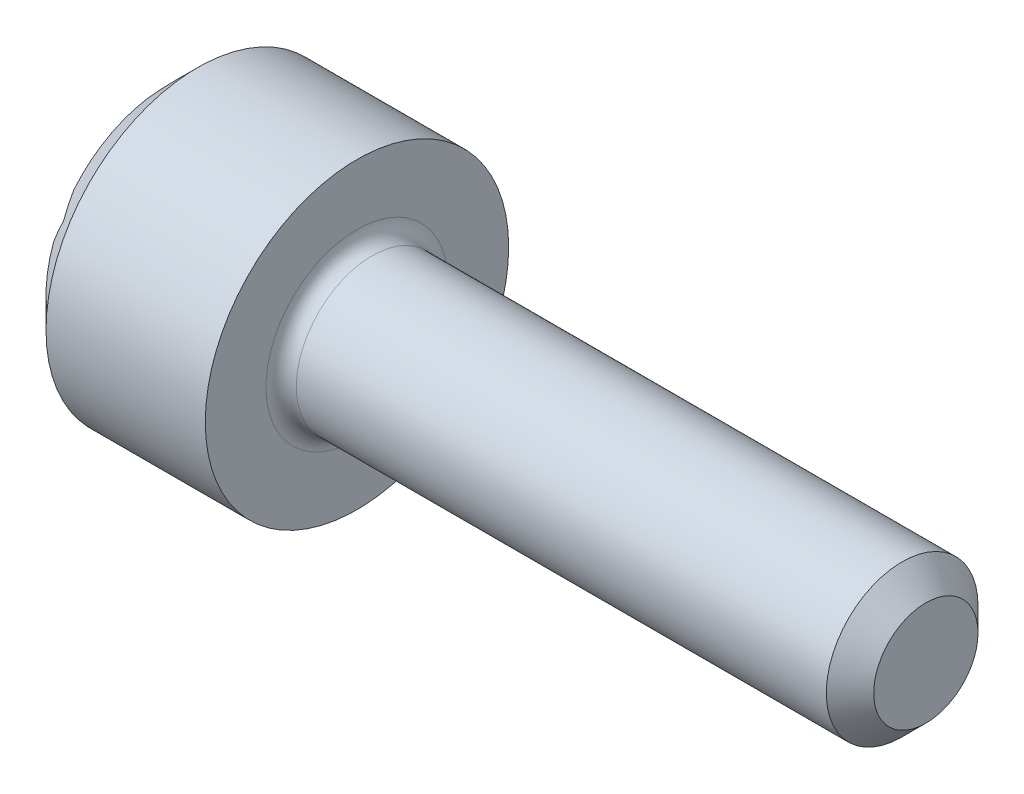
ISO-10303-21;
HEADER;
FILE_DESCRIPTION(('STEP AP214'),'2;1');
FILE_NAME('part.step','',(''),(''),'','','');
FILE_SCHEMA(('AUTOMOTIVE_DESIGN { 1 0 10303 214 1 1 1 1 }'));
ENDSEC;
DATA;
#1=APPLICATION_CONTEXT('core data for automotive mechanical design processes');
#2=APPLICATION_PROTOCOL_DEFINITION('international standard','automotive_design',2000,#1);
#3=PRODUCT_CONTEXT('',#1,'mechanical');
#4=PRODUCT('Part','Part','',(#3));
#5=PRODUCT_RELATED_PRODUCT_CATEGORY('part','',(#4));
#6=PRODUCT_DEFINITION_FORMATION('','',#4);
#7=PRODUCT_DEFINITION_CONTEXT('part definition',#1,'design');
#8=PRODUCT_DEFINITION('design','',#6,#7);
#9=PRODUCT_DEFINITION_SHAPE('','',#8);
#10=(LENGTH_UNIT() NAMED_UNIT(*) SI_UNIT(.MILLI.,.METRE.));
#11=(NAMED_UNIT(*) PLANE_ANGLE_UNIT() SI_UNIT($,.RADIAN.));
#12=(NAMED_UNIT(*) SI_UNIT($,.STERADIAN.) SOLID_ANGLE_UNIT());
#13=UNCERTAINTY_MEASURE_WITH_UNIT(LENGTH_MEASURE(1.E-05),#10,'distance_accuracy_value','');
#14=(GEOMETRIC_REPRESENTATION_CONTEXT(3) GLOBAL_UNCERTAINTY_ASSIGNED_CONTEXT((#13)) GLOBAL_UNIT_ASSIGNED_CONTEXT((#10,
#11,#12)) REPRESENTATION_CONTEXT('',''));
#15=CARTESIAN_POINT('',(0.,0.,0.));
#16=DIRECTION('',(0.,0.,1.));
#17=DIRECTION('',(1.,0.,0.));
#18=AXIS2_PLACEMENT_3D('',#15,#16,#17);
#19=CARTESIAN_POINT('',(0.,0.,0.));
#20=DIRECTION('',(-1.,0.,0.));
#21=DIRECTION('',(0.,0.,1.));
#22=AXIS2_PLACEMENT_3D('',#19,#20,#21);
#23=PLANE('',#22);
#24=DIRECTION('',(0.,0.5,-0.866025403784439));
#25=VECTOR('',#24,1.);
#26=CARTESIAN_POINT('',(0.,1.73205080756888,3.));
#27=LINE('',#26,#25);
#28=CARTESIAN_POINT('',(0.,2.04129977507032,2.46436507609928));
#29=VERTEX_POINT('',#28);
#30=CARTESIAN_POINT('',(0.,3.15485264763631,0.535634923900716));
#31=VERTEX_POINT('',#30);
#32=EDGE_CURVE('E191',#29,#31,#27,.T.);
#33=ORIENTED_EDGE('',*,*,#32,.F.);
#34=CARTESIAN_POINT('',(0.,0.,0.));
#35=DIRECTION('',(-1.,0.,0.));
#36=DIRECTION('',(0.,0.,1.));
#37=AXIS2_PLACEMENT_3D('',#34,#35,#36);
#38=CIRCLE('',#37,3.19999999999999);
#39=EDGE_CURVE('E238',#29,#31,#38,.T.);
#40=ORIENTED_EDGE('',*,*,#39,.T.);
#41=EDGE_LOOP('',(#33,#40));
#42=FACE_BOUND('',#41,.T.);
#43=ADVANCED_FACE('F33',(#42),#23,.T.);
#44=DIRECTION('',(0.,-0.5,-0.866025403784439));
#45=VECTOR('',#44,1.);
#46=CARTESIAN_POINT('',(0.,3.46410161513775,0.));
#47=LINE('',#46,#45);
#48=CARTESIAN_POINT('',(0.,3.15485264763631,-0.535634923900718));
#49=VERTEX_POINT('',#48);
#50=CARTESIAN_POINT('',(0.,2.04129977507032,-2.46436507609928));
#51=VERTEX_POINT('',#50);
#52=EDGE_CURVE('E194',#49,#51,#47,.T.);
#53=ORIENTED_EDGE('',*,*,#52,.F.);
#54=CARTESIAN_POINT('',(0.,0.,0.));
#55=DIRECTION('',(-1.,0.,0.));
#56=DIRECTION('',(0.,0.,1.));
#57=AXIS2_PLACEMENT_3D('',#54,#55,#56);
#58=CIRCLE('',#57,3.19999999999999);
#59=EDGE_CURVE('E236',#49,#51,#58,.T.);
#60=ORIENTED_EDGE('',*,*,#59,.T.);
#61=EDGE_LOOP('',(#53,#60));
#62=FACE_BOUND('',#61,.T.);
#63=ADVANCED_FACE('F303',(#62),#23,.T.);
#64=DIRECTION('',(0.,-1.,0.));
#65=VECTOR('',#64,1.);
#66=CARTESIAN_POINT('',(0.,1.73205080756888,-3.));
#67=LINE('',#66,#65);
#68=CARTESIAN_POINT('',(0.,1.11355287256599,-3.));
#69=VERTEX_POINT('',#68);
#70=CARTESIAN_POINT('',(0.,-1.11355287256599,-3.));
#71=VERTEX_POINT('',#70);
#72=EDGE_CURVE('E156',#69,#71,#67,.T.);
#73=ORIENTED_EDGE('',*,*,#72,.F.);
#74=CARTESIAN_POINT('',(0.,0.,0.));
#75=DIRECTION('',(-1.,0.,0.));
#76=DIRECTION('',(0.,0.,1.));
#77=AXIS2_PLACEMENT_3D('',#74,#75,#76);
#78=CIRCLE('',#77,3.19999999999999);
#79=EDGE_CURVE('E234',#69,#71,#78,.T.);
#80=ORIENTED_EDGE('',*,*,#79,.T.);
#81=EDGE_LOOP('',(#73,#80));
#82=FACE_BOUND('',#81,.T.);
#83=ADVANCED_FACE('F310',(#82),#23,.T.);
#84=DIRECTION('',(0.,-0.5,0.866025403784439));
#85=VECTOR('',#84,1.);
#86=CARTESIAN_POINT('',(0.,-1.73205080756888,-3.));
#87=LINE('',#86,#85);
#88=CARTESIAN_POINT('',(0.,-2.04129977507032,-2.46436507609928));
#89=VERTEX_POINT('',#88);
#90=CARTESIAN_POINT('',(0.,-3.15485264763631,-0.535634923900718));
#91=VERTEX_POINT('',#90);
#92=EDGE_CURVE('E184',#89,#91,#87,.T.);
#93=ORIENTED_EDGE('',*,*,#92,.F.);
#94=CARTESIAN_POINT('',(0.,0.,0.));
#95=DIRECTION('',(-1.,0.,0.));
#96=DIRECTION('',(0.,0.,1.));
#97=AXIS2_PLACEMENT_3D('',#94,#95,#96);
#98=CIRCLE('',#97,3.19999999999999);
#99=EDGE_CURVE('E232',#89,#91,#98,.T.);
#100=ORIENTED_EDGE('',*,*,#99,.T.);
#101=EDGE_LOOP('',(#93,#100));
#102=FACE_BOUND('',#101,.T.);
#103=ADVANCED_FACE('F324',(#102),#23,.T.);
#104=DIRECTION('',(0.,0.5,0.866025403784439));
#105=VECTOR('',#104,1.);
#106=CARTESIAN_POINT('',(0.,-3.46410161513775,0.));
#107=LINE('',#106,#105);
#108=CARTESIAN_POINT('',(0.,-3.15485264763631,0.53563492390072));
#109=VERTEX_POINT('',#108);
#110=CARTESIAN_POINT('',(0.,-2.04129977507032,2.46436507609928));
#111=VERTEX_POINT('',#110);
#112=EDGE_CURVE('E186',#109,#111,#107,.T.);
#113=ORIENTED_EDGE('',*,*,#112,.F.);
#114=CARTESIAN_POINT('',(0.,0.,0.));
#115=DIRECTION('',(-1.,0.,0.));
#116=DIRECTION('',(0.,0.,1.));
#117=AXIS2_PLACEMENT_3D('',#114,#115,#116);
#118=CIRCLE('',#117,3.19999999999999);
#119=EDGE_CURVE('E230',#109,#111,#118,.T.);
#120=ORIENTED_EDGE('',*,*,#119,.T.);
#121=EDGE_LOOP('',(#113,#120));
#122=FACE_BOUND('',#121,.T.);
#123=ADVANCED_FACE('F316',(#122),#23,.T.);
#124=DIRECTION('',(0.,1.,0.));
#125=VECTOR('',#124,1.);
#126=CARTESIAN_POINT('',(0.,-1.73205080756888,3.));
#127=LINE('',#126,#125);
#128=CARTESIAN_POINT('',(0.,-1.11355287256599,3.));
#129=VERTEX_POINT('',#128);
#130=CARTESIAN_POINT('',(0.,1.11355287256599,3.));
#131=VERTEX_POINT('',#130);
#132=EDGE_CURVE('E188',#129,#131,#127,.T.);
#133=ORIENTED_EDGE('',*,*,#132,.F.);
#134=CARTESIAN_POINT('',(0.,0.,0.));
#135=DIRECTION('',(-1.,0.,0.));
#136=DIRECTION('',(0.,0.,1.));
#137=AXIS2_PLACEMENT_3D('',#134,#135,#136);
#138=CIRCLE('',#137,3.19999999999999);
#139=EDGE_CURVE('E228',#129,#131,#138,.T.);
#140=ORIENTED_EDGE('',*,*,#139,.T.);
#141=EDGE_LOOP('',(#133,#140));
#142=FACE_BOUND('',#141,.T.);
#143=ADVANCED_FACE('F306',(#142),#23,.T.);
#144=CARTESIAN_POINT('',(20.,0.,0.));
#145=DIRECTION('',(1.,0.,0.));
#146=DIRECTION('',(0.,0.,-1.));
#147=AXIS2_PLACEMENT_3D('',#144,#145,#146);
#148=CYLINDRICAL_SURFACE('',#147,4.);
#149=CARTESIAN_POINT('',(0.800000000000002,0.,0.));
#150=DIRECTION('',(-1.,0.,0.));
#151=DIRECTION('',(0.,0.,1.));
#152=AXIS2_PLACEMENT_3D('',#149,#150,#151);
#153=CIRCLE('',#152,4.);
#154=CARTESIAN_POINT('',(0.800000000000002,0.,4.));
#155=VERTEX_POINT('',#154);
#156=EDGE_CURVE('E225',#155,#155,#153,.F.);
#157=ORIENTED_EDGE('',*,*,#156,.T.);
#158=EDGE_LOOP('',(#157));
#159=FACE_BOUND('',#158,.T.);
#160=CARTESIAN_POINT('',(5.,0.,0.));
#161=DIRECTION('',(1.,0.,0.));
#162=DIRECTION('',(0.,0.,-1.));
#163=AXIS2_PLACEMENT_3D('',#160,#161,#162);
#164=CIRCLE('',#163,4.);
#165=CARTESIAN_POINT('',(5.,0.,-4.));
#166=VERTEX_POINT('',#165);
#167=EDGE_CURVE('E215',#166,#166,#164,.T.);
#168=ORIENTED_EDGE('',*,*,#167,.F.);
#169=EDGE_LOOP('',(#168));
#170=FACE_BOUND('',#169,.T.);
#171=ADVANCED_FACE('F315',(#159,#170),#148,.T.);
#172=CARTESIAN_POINT('',(5.,0.,-4.));
#173=DIRECTION('',(1.,0.,0.));
#174=DIRECTION('',(0.,0.,-1.));
#175=AXIS2_PLACEMENT_3D('',#172,#173,#174);
#176=PLANE('',#175);
#177=CARTESIAN_POINT('',(5.,0.,0.));
#178=DIRECTION('',(1.,0.,0.));
#179=DIRECTION('',(0.,0.,-1.));
#180=AXIS2_PLACEMENT_3D('',#177,#178,#179);
#181=CIRCLE('',#180,2.4);
#182=CARTESIAN_POINT('',(5.,0.,-2.4));
#183=VERTEX_POINT('',#182);
#184=EDGE_CURVE('E11',#183,#183,#181,.F.);
#185=ORIENTED_EDGE('',*,*,#184,.T.);
#186=EDGE_LOOP('',(#185));
#187=FACE_BOUND('',#186,.T.);
#188=ORIENTED_EDGE('',*,*,#167,.T.);
#189=EDGE_LOOP('',(#188));
#190=FACE_BOUND('',#189,.T.);
#191=ADVANCED_FACE('F322',(#187,#190),#176,.T.);
#192=CARTESIAN_POINT('',(20.,0.,0.));
#193=DIRECTION('',(1.,0.,0.));
#194=DIRECTION('',(0.,0.,-1.));
#195=AXIS2_PLACEMENT_3D('',#192,#193,#194);
#196=CYLINDRICAL_SURFACE('',#195,2.);
#197=CARTESIAN_POINT('',(5.4,0.,0.));
#198=DIRECTION('',(1.,0.,0.));
#199=DIRECTION('',(0.,0.,-1.));
#200=AXIS2_PLACEMENT_3D('',#197,#198,#199);
#201=CIRCLE('',#200,2.);
#202=CARTESIAN_POINT('',(5.4,0.,-2.));
#203=VERTEX_POINT('',#202);
#204=EDGE_CURVE('E41',#203,#203,#201,.T.);
#205=ORIENTED_EDGE('',*,*,#204,.T.);
#206=EDGE_LOOP('',(#205));
#207=FACE_BOUND('',#206,.T.);
#208=CARTESIAN_POINT('',(19.375,0.,0.));
#209=DIRECTION('',(1.,0.,0.));
#210=DIRECTION('',(0.,0.,-1.));
#211=AXIS2_PLACEMENT_3D('',#208,#209,#210);
#212=CIRCLE('',#211,2.);
#213=CARTESIAN_POINT('',(19.375,0.,-2.));
#214=VERTEX_POINT('',#213);
#215=EDGE_CURVE('E222',#214,#214,#212,.F.);
#216=ORIENTED_EDGE('',*,*,#215,.T.);
#217=EDGE_LOOP('',(#216));
#218=FACE_BOUND('',#217,.T.);
#219=ADVANCED_FACE('F291',(#207,#218),#196,.T.);
#220=CARTESIAN_POINT('',(20.,0.,-2.));
#221=DIRECTION('',(1.,0.,0.));
#222=DIRECTION('',(0.,0.,-1.));
#223=AXIS2_PLACEMENT_3D('',#220,#221,#222);
#224=PLANE('',#223);
#225=CARTESIAN_POINT('',(20.,0.,0.));
#226=DIRECTION('',(1.,0.,0.));
#227=DIRECTION('',(0.,0.,-1.));
#228=AXIS2_PLACEMENT_3D('',#225,#226,#227);
#229=CIRCLE('',#228,1.375);
#230=CARTESIAN_POINT('',(20.,0.,-1.375));
#231=VERTEX_POINT('',#230);
#232=EDGE_CURVE('E219',#231,#231,#229,.T.);
#233=ORIENTED_EDGE('',*,*,#232,.T.);
#234=EDGE_LOOP('',(#233));
#235=FACE_BOUND('',#234,.T.);
#236=ADVANCED_FACE('F367',(#235),#224,.T.);
#237=CARTESIAN_POINT('',(20.,0.,0.));
#238=DIRECTION('',(-1.,0.,0.));
#239=DIRECTION('',(0.,0.,1.));
#240=AXIS2_PLACEMENT_3D('',#237,#238,#239);
#241=CONICAL_SURFACE('',#240,1.375,0.785398163397446);
#242=ORIENTED_EDGE('',*,*,#215,.F.);
#243=EDGE_LOOP('',(#242));
#244=FACE_BOUND('',#243,.T.);
#245=ORIENTED_EDGE('',*,*,#232,.F.);
#246=EDGE_LOOP('',(#245));
#247=FACE_BOUND('',#246,.T.);
#248=ADVANCED_FACE('F361',(#244,#247),#241,.T.);
#249=CARTESIAN_POINT('',(4.,-1.73205080756888,-3.));
#250=DIRECTION('',(0.,-0.866025403784439,-0.5));
#251=DIRECTION('',(0.,0.5,-0.866025403784439));
#252=AXIS2_PLACEMENT_3D('',#249,#250,#251);
#253=PLANE('',#252);
#254=DIRECTION('',(-1.,0.,0.));
#255=VECTOR('',#254,1.);
#256=CARTESIAN_POINT('',(4.,-1.73205080756888,-3.));
#257=LINE('',#256,#255);
#258=CARTESIAN_POINT('',(4.,-1.73205080756888,-3.));
#259=VERTEX_POINT('',#258);
#260=CARTESIAN_POINT('',(0.264101615137759,-1.73205080756888,-3.));
#261=VERTEX_POINT('',#260);
#262=EDGE_CURVE('E199',#259,#261,#257,.T.);
#263=ORIENTED_EDGE('',*,*,#262,.T.);
#264=CARTESIAN_POINT('',(0.264101615137759,-1.73205080756888,-3.));
#265=CARTESIAN_POINT('',(0.239013045834171,-1.75714195340964,-2.95654086058369));
#266=CARTESIAN_POINT('',(0.21457247390792,-1.78239782369679,-2.91279641005696));
#267=CARTESIAN_POINT('',(0.167188466711546,-1.83322609179336,-2.82475926725298));
#268=CARTESIAN_POINT('',(0.144243512742114,-1.85879813612875,-2.78046718721067));
#269=CARTESIAN_POINT('',(0.0999964216523164,-1.91030100221665,-2.69126160641101));
#270=CARTESIAN_POINT('',(0.0786945049648062,-1.93623187156128,-2.64634802322169));
#271=CARTESIAN_POINT('',(0.0379179650521343,-1.988480607889,-2.5558505572708));
#272=CARTESIAN_POINT('',(0.0184452524003178,-2.01479884701433,-2.51026602993998));
#273=CARTESIAN_POINT('',(0.,-2.04129977507032,-2.46436507609928));
#274=B_SPLINE_CURVE_WITH_KNOTS('',3,(#264,#265,#266,#267,#268,#269,#270,#271,#272,#273),
.UNSPECIFIED.,.F.,.F.,(4,2,2,2,4),(0.,0.168315435098067,0.336457205423019,0.504621494855378,
0.672959520299338),.UNSPECIFIED.);
#275=EDGE_CURVE('E336',#261,#89,#274,.T.);
#276=ORIENTED_EDGE('',*,*,#275,.T.);
#277=ORIENTED_EDGE('',*,*,#92,.T.);
#278=CARTESIAN_POINT('',(0.,-3.15485264763631,-0.535634923900718));
#279=CARTESIAN_POINT('',(0.018445252400318,-3.1813535756923,-0.489733970060021));
#280=CARTESIAN_POINT('',(0.0379179650521344,-3.20767181481763,-0.444149442729196));
#281=CARTESIAN_POINT('',(0.0786945049648063,-3.25992055114536,-0.353651976778307));
#282=CARTESIAN_POINT('',(0.0999964216523164,-3.28585142048998,-0.308738393588991));
#283=CARTESIAN_POINT('',(0.144243512742113,-3.33735428657788,-0.219532812789328));
#284=CARTESIAN_POINT('',(0.167188466711546,-3.36292633091328,-0.175240732747017));
#285=CARTESIAN_POINT('',(0.21457247390792,-3.41375459900984,-0.0872035899430408));
#286=CARTESIAN_POINT('',(0.239013045834171,-3.439010469297,-0.043459139416314));
#287=CARTESIAN_POINT('',(0.264101615137759,-3.46410161513775,0.));
#288=B_SPLINE_CURVE_WITH_KNOTS('',3,(#278,#279,#280,#281,#282,#283,#284,#285,#286,#287),
.UNSPECIFIED.,.F.,.F.,(4,2,2,2,4),(0.,0.16833802544396,0.336502314876319,0.504644085201271,
0.672959520299337),.UNSPECIFIED.);
#289=CARTESIAN_POINT('',(0.264101615137759,-3.46410161513775,0.));
#290=VERTEX_POINT('',#289);
#291=EDGE_CURVE('E56',#91,#290,#288,.T.);
#292=ORIENTED_EDGE('',*,*,#291,.T.);
#293=DIRECTION('',(-1.,0.,0.));
#294=VECTOR('',#293,1.);
#295=CARTESIAN_POINT('',(4.,-3.46410161513775,0.));
#296=LINE('',#295,#294);
#297=CARTESIAN_POINT('',(4.,-3.46410161513775,0.));
#298=VERTEX_POINT('',#297);
#299=EDGE_CURVE('E158',#298,#290,#296,.T.);
#300=ORIENTED_EDGE('',*,*,#299,.F.);
#301=DIRECTION('',(0.,-0.5,0.866025403784439));
#302=VECTOR('',#301,1.);
#303=CARTESIAN_POINT('',(4.,-1.73205080756888,-3.));
#304=LINE('',#303,#302);
#305=CARTESIAN_POINT('',(4.,-2.59807621135332,-1.5));
#306=VERTEX_POINT('',#305);
#307=EDGE_CURVE('E147',#306,#298,#304,.T.);
#308=ORIENTED_EDGE('',*,*,#307,.F.);
#309=EDGE_CURVE('E155',#259,#306,#304,.T.);
#310=ORIENTED_EDGE('',*,*,#309,.F.);
#311=EDGE_LOOP('',(#263,#276,#277,#292,#300,#308,#310));
#312=FACE_BOUND('',#311,.T.);
#313=ADVANCED_FACE('F160',(#312),#253,.F.);
#314=CARTESIAN_POINT('',(4.,1.73205080756888,-3.));
#315=DIRECTION('',(0.,0.,-1.));
#316=DIRECTION('',(-1.,0.,0.));
#317=AXIS2_PLACEMENT_3D('',#314,#315,#316);
#318=PLANE('',#317);
#319=DIRECTION('',(-1.,0.,0.));
#320=VECTOR('',#319,1.);
#321=CARTESIAN_POINT('',(4.,1.73205080756888,-3.));
#322=LINE('',#321,#320);
#323=CARTESIAN_POINT('',(4.,1.73205080756888,-3.));
#324=VERTEX_POINT('',#323);
#325=CARTESIAN_POINT('',(0.264101615137759,1.73205080756888,-3.));
#326=VERTEX_POINT('',#325);
#327=EDGE_CURVE('E202',#324,#326,#322,.T.);
#328=ORIENTED_EDGE('',*,*,#327,.T.);
#329=CARTESIAN_POINT('',(0.264101615137759,1.73205080756888,-3.));
#330=CARTESIAN_POINT('',(0.239013045834171,1.68186851588736,-3.));
#331=CARTESIAN_POINT('',(0.21457247390792,1.63135677531305,-3.));
#332=CARTESIAN_POINT('',(0.167188466711546,1.52970023911992,-3.));
#333=CARTESIAN_POINT('',(0.144243512742113,1.47855615044913,-3.));
#334=CARTESIAN_POINT('',(0.0999964216523164,1.37555041827332,-3.));
#335=CARTESIAN_POINT('',(0.0786945049648062,1.32368867958408,-3.));
#336=CARTESIAN_POINT('',(0.0379179650521341,1.21919120692863,-3.));
#337=CARTESIAN_POINT('',(0.0184452524003176,1.16655472867796,-3.));
#338=CARTESIAN_POINT('',(0.,1.11355287256599,-3.));
#339=B_SPLINE_CURVE_WITH_KNOTS('',3,(#329,#330,#331,#332,#333,#334,#335,#336,#337,#338),
.UNSPECIFIED.,.F.,.F.,(4,2,2,2,4),(0.,0.168315435098067,0.336457205423019,0.504621494855379,
0.672959520299339),.UNSPECIFIED.);
#340=EDGE_CURVE('E560',#326,#69,#339,.T.);
#341=ORIENTED_EDGE('',*,*,#340,.T.);
#342=ORIENTED_EDGE('',*,*,#72,.T.);
#343=CARTESIAN_POINT('',(0.,-1.11355287256599,-3.));
#344=CARTESIAN_POINT('',(0.0184452524003176,-1.16655472867796,-3.));
#345=CARTESIAN_POINT('',(0.037917965052134,-1.21919120692863,-3.));
#346=CARTESIAN_POINT('',(0.0786945049648061,-1.32368867958408,-3.));
#347=CARTESIAN_POINT('',(0.0999964216523163,-1.37555041827332,-3.));
#348=CARTESIAN_POINT('',(0.144243512742113,-1.47855615044913,-3.));
#349=CARTESIAN_POINT('',(0.167188466711546,-1.52970023911992,-3.));
#350=CARTESIAN_POINT('',(0.21457247390792,-1.63135677531305,-3.));
#351=CARTESIAN_POINT('',(0.239013045834171,-1.68186851588736,-3.));
#352=CARTESIAN_POINT('',(0.264101615137759,-1.73205080756888,-3.));
#353=B_SPLINE_CURVE_WITH_KNOTS('',3,(#343,#344,#345,#346,#347,#348,#349,#350,#351,#352),
.UNSPECIFIED.,.F.,.F.,(4,2,2,2,4),(0.,0.16833802544396,0.336502314876319,0.504644085201271,
0.672959520299339),.UNSPECIFIED.);
#354=EDGE_CURVE('E561',#71,#261,#353,.T.);
#355=ORIENTED_EDGE('',*,*,#354,.T.);
#356=ORIENTED_EDGE('',*,*,#262,.F.);
#357=DIRECTION('',(0.,-1.,0.));
#358=VECTOR('',#357,1.);
#359=CARTESIAN_POINT('',(4.,1.73205080756888,-3.));
#360=LINE('',#359,#358);
#361=CARTESIAN_POINT('',(4.,0.,-3.));
#362=VERTEX_POINT('',#361);
#363=EDGE_CURVE('E181',#362,#259,#360,.T.);
#364=ORIENTED_EDGE('',*,*,#363,.F.);
#365=EDGE_CURVE('E163',#324,#362,#360,.T.);
#366=ORIENTED_EDGE('',*,*,#365,.F.);
#367=EDGE_LOOP('',(#328,#341,#342,#355,#356,#364,#366));
#368=FACE_BOUND('',#367,.T.);
#369=ADVANCED_FACE('F360',(#368),#318,.F.);
#370=CARTESIAN_POINT('',(4.,3.46410161513775,0.));
#371=DIRECTION('',(0.,0.866025403784439,-0.5));
#372=DIRECTION('',(0.,0.5,0.866025403784439));
#373=AXIS2_PLACEMENT_3D('',#370,#371,#372);
#374=PLANE('',#373);
#375=DIRECTION('',(-1.,0.,0.));
#376=VECTOR('',#375,1.);
#377=CARTESIAN_POINT('',(4.,3.46410161513775,0.));
#378=LINE('',#377,#376);
#379=CARTESIAN_POINT('',(4.,3.46410161513775,0.));
#380=VERTEX_POINT('',#379);
#381=CARTESIAN_POINT('',(0.264101615137759,3.46410161513775,0.));
#382=VERTEX_POINT('',#381);
#383=EDGE_CURVE('E205',#380,#382,#378,.T.);
#384=ORIENTED_EDGE('',*,*,#383,.T.);
#385=CARTESIAN_POINT('',(0.264101615137759,3.46410161513775,0.));
#386=CARTESIAN_POINT('',(0.239013045834171,3.439010469297,-0.043459139416314));
#387=CARTESIAN_POINT('',(0.21457247390792,3.41375459900984,-0.0872035899430408));
#388=CARTESIAN_POINT('',(0.167188466711546,3.36292633091328,-0.175240732747017));
#389=CARTESIAN_POINT('',(0.144243512742113,3.33735428657788,-0.219532812789328));
#390=CARTESIAN_POINT('',(0.099996421652316,3.28585142048998,-0.308738393588991));
#391=CARTESIAN_POINT('',(0.078694504964806,3.25992055114536,-0.353651976778307));
#392=CARTESIAN_POINT('',(0.0379179650521343,3.20767181481763,-0.444149442729196));
#393=CARTESIAN_POINT('',(0.0184452524003179,3.1813535756923,-0.489733970060021));
#394=CARTESIAN_POINT('',(0.,3.15485264763631,-0.535634923900718));
#395=B_SPLINE_CURVE_WITH_KNOTS('',3,(#385,#386,#387,#388,#389,#390,#391,#392,#393,#394),
.UNSPECIFIED.,.F.,.F.,(4,2,2,2,4),(0.,0.168315435098067,0.336457205423019,0.504621494855378,
0.672959520299337),.UNSPECIFIED.);
#396=EDGE_CURVE('E564',#382,#49,#395,.T.);
#397=ORIENTED_EDGE('',*,*,#396,.T.);
#398=ORIENTED_EDGE('',*,*,#52,.T.);
#399=CARTESIAN_POINT('',(0.,2.04129977507032,-2.46436507609928));
#400=CARTESIAN_POINT('',(0.0184452524003174,2.01479884701433,-2.51026602993998));
#401=CARTESIAN_POINT('',(0.0379179650521339,1.988480607889,-2.5558505572708));
#402=CARTESIAN_POINT('',(0.0786945049648062,1.93623187156128,-2.64634802322169));
#403=CARTESIAN_POINT('',(0.0999964216523166,1.91030100221665,-2.69126160641101));
#404=CARTESIAN_POINT('',(0.144243512742114,1.85879813612875,-2.78046718721067));
#405=CARTESIAN_POINT('',(0.167188466711547,1.83322609179336,-2.82475926725298));
#406=CARTESIAN_POINT('',(0.21457247390792,1.78239782369679,-2.91279641005696));
#407=CARTESIAN_POINT('',(0.239013045834171,1.75714195340964,-2.95654086058369));
#408=CARTESIAN_POINT('',(0.264101615137759,1.73205080756888,-3.));
#409=B_SPLINE_CURVE_WITH_KNOTS('',3,(#399,#400,#401,#402,#403,#404,#405,#406,#407,#408),
.UNSPECIFIED.,.F.,.F.,(4,2,2,2,4),(0.,0.16833802544396,0.336502314876319,0.504644085201272,
0.672959520299338),.UNSPECIFIED.);
#410=EDGE_CURVE('E581',#51,#326,#409,.T.);
#411=ORIENTED_EDGE('',*,*,#410,.T.);
#412=ORIENTED_EDGE('',*,*,#327,.F.);
#413=DIRECTION('',(0.,-0.5,-0.866025403784439));
#414=VECTOR('',#413,1.);
#415=CARTESIAN_POINT('',(4.,3.46410161513775,0.));
#416=LINE('',#415,#414);
#417=CARTESIAN_POINT('',(4.,2.59807621135332,-1.5));
#418=VERTEX_POINT('',#417);
#419=EDGE_CURVE('E177',#418,#324,#416,.T.);
#420=ORIENTED_EDGE('',*,*,#419,.F.);
#421=EDGE_CURVE('E178',#380,#418,#416,.T.);
#422=ORIENTED_EDGE('',*,*,#421,.F.);
#423=EDGE_LOOP('',(#384,#397,#398,#411,#412,#420,#422));
#424=FACE_BOUND('',#423,.T.);
#425=ADVANCED_FACE('F263',(#424),#374,.F.);
#426=CARTESIAN_POINT('',(4.,1.73205080756888,3.));
#427=DIRECTION('',(0.,0.866025403784439,0.5));
#428=DIRECTION('',(0.,-0.5,0.866025403784439));
#429=AXIS2_PLACEMENT_3D('',#426,#427,#428);
#430=PLANE('',#429);
#431=ORIENTED_EDGE('',*,*,#32,.T.);
#432=CARTESIAN_POINT('',(0.,3.15485264763631,0.535634923900716));
#433=CARTESIAN_POINT('',(0.018445252400318,3.1813535756923,0.489733970060019));
#434=CARTESIAN_POINT('',(0.0379179650521344,3.20767181481763,0.444149442729195));
#435=CARTESIAN_POINT('',(0.0786945049648063,3.25992055114536,0.353651976778306));
#436=CARTESIAN_POINT('',(0.0999964216523164,3.28585142048998,0.30873839358899));
#437=CARTESIAN_POINT('',(0.144243512742113,3.33735428657788,0.219532812789327));
#438=CARTESIAN_POINT('',(0.167188466711546,3.36292633091328,0.175240732747017));
#439=CARTESIAN_POINT('',(0.21457247390792,3.41375459900984,0.0872035899430405));
#440=CARTESIAN_POINT('',(0.239013045834171,3.439010469297,0.0434591394163137));
#441=CARTESIAN_POINT('',(0.264101615137759,3.46410161513775,0.));
#442=B_SPLINE_CURVE_WITH_KNOTS('',3,(#432,#433,#434,#435,#436,#437,#438,#439,#440,#441),
.UNSPECIFIED.,.F.,.F.,(4,2,2,2,4),(0.,0.168338025443959,0.336502314876318,0.504644085201269,
0.672959520299336),.UNSPECIFIED.);
#443=EDGE_CURVE('E248',#31,#382,#442,.T.);
#444=ORIENTED_EDGE('',*,*,#443,.T.);
#445=ORIENTED_EDGE('',*,*,#383,.F.);
#446=DIRECTION('',(0.,0.5,-0.866025403784439));
#447=VECTOR('',#446,1.);
#448=CARTESIAN_POINT('',(4.,1.73205080756888,3.));
#449=LINE('',#448,#447);
#450=CARTESIAN_POINT('',(4.,2.59807621135332,1.5));
#451=VERTEX_POINT('',#450);
#452=EDGE_CURVE('E173',#451,#380,#449,.T.);
#453=ORIENTED_EDGE('',*,*,#452,.F.);
#454=CARTESIAN_POINT('',(4.,1.73205080756888,3.));
#455=VERTEX_POINT('',#454);
#456=EDGE_CURVE('E174',#455,#451,#449,.T.);
#457=ORIENTED_EDGE('',*,*,#456,.F.);
#458=DIRECTION('',(-1.,0.,0.));
#459=VECTOR('',#458,1.);
#460=CARTESIAN_POINT('',(4.,1.73205080756888,3.));
#461=LINE('',#460,#459);
#462=CARTESIAN_POINT('',(0.264101615137759,1.73205080756888,3.));
#463=VERTEX_POINT('',#462);
#464=EDGE_CURVE('E208',#455,#463,#461,.T.);
#465=ORIENTED_EDGE('',*,*,#464,.T.);
#466=CARTESIAN_POINT('',(0.264101615137759,1.73205080756888,3.));
#467=CARTESIAN_POINT('',(0.239013045834172,1.75714195340964,2.95654086058369));
#468=CARTESIAN_POINT('',(0.21457247390792,1.78239782369679,2.91279641005696));
#469=CARTESIAN_POINT('',(0.167188466711546,1.83322609179335,2.82475926725298));
#470=CARTESIAN_POINT('',(0.144243512742113,1.85879813612875,2.78046718721067));
#471=CARTESIAN_POINT('',(0.0999964216523165,1.91030100221665,2.69126160641101));
#472=CARTESIAN_POINT('',(0.0786945049648064,1.93623187156128,2.64634802322169));
#473=CARTESIAN_POINT('',(0.0379179650521346,1.988480607889,2.55585055727081));
#474=CARTESIAN_POINT('',(0.0184452524003182,2.01479884701433,2.51026602993998));
#475=CARTESIAN_POINT('',(0.,2.04129977507032,2.46436507609928));
#476=B_SPLINE_CURVE_WITH_KNOTS('',3,(#466,#467,#468,#469,#470,#471,#472,#473,#474,#475),
.UNSPECIFIED.,.F.,.F.,(4,2,2,2,4),(0.,0.168315435098067,0.336457205423018,0.504621494855377,
0.672959520299336),.UNSPECIFIED.);
#477=EDGE_CURVE('E241',#463,#29,#476,.T.);
#478=ORIENTED_EDGE('',*,*,#477,.T.);
#479=EDGE_LOOP('',(#431,#444,#445,#453,#457,#465,#478));
#480=FACE_BOUND('',#479,.T.);
#481=ADVANCED_FACE('F257',(#480),#430,.F.);
#482=CARTESIAN_POINT('',(4.,-1.73205080756888,3.));
#483=DIRECTION('',(0.,0.,1.));
#484=DIRECTION('',(0.,-1.,0.));
#485=AXIS2_PLACEMENT_3D('',#482,#483,#484);
#486=PLANE('',#485);
#487=DIRECTION('',(-1.,0.,0.));
#488=VECTOR('',#487,1.);
#489=CARTESIAN_POINT('',(4.,-1.73205080756888,3.));
#490=LINE('',#489,#488);
#491=CARTESIAN_POINT('',(4.,-1.73205080756888,3.));
#492=VERTEX_POINT('',#491);
#493=CARTESIAN_POINT('',(0.26410161513776,-1.73205080756888,3.));
#494=VERTEX_POINT('',#493);
#495=EDGE_CURVE('E162',#492,#494,#490,.T.);
#496=ORIENTED_EDGE('',*,*,#495,.T.);
#497=CARTESIAN_POINT('',(0.26410161513776,-1.73205080756888,3.));
#498=CARTESIAN_POINT('',(0.239013045834172,-1.68186851588736,3.));
#499=CARTESIAN_POINT('',(0.214572473907921,-1.63135677531305,3.));
#500=CARTESIAN_POINT('',(0.167188466711547,-1.52970023911992,3.));
#501=CARTESIAN_POINT('',(0.144243512742114,-1.47855615044913,3.));
#502=CARTESIAN_POINT('',(0.0999964216523171,-1.37555041827332,3.));
#503=CARTESIAN_POINT('',(0.0786945049648069,-1.32368867958408,3.));
#504=CARTESIAN_POINT('',(0.0379179650521347,-1.21919120692863,3.));
#505=CARTESIAN_POINT('',(0.0184452524003181,-1.16655472867796,3.));
#506=CARTESIAN_POINT('',(0.,-1.11355287256599,3.));
#507=B_SPLINE_CURVE_WITH_KNOTS('',3,(#497,#498,#499,#500,#501,#502,#503,#504,#505,#506),
.UNSPECIFIED.,.F.,.F.,(4,2,2,2,4),(0.,0.168315435098067,0.336457205423019,0.504621494855379,
0.67295952029934),.UNSPECIFIED.);
#508=EDGE_CURVE('E283',#494,#129,#507,.T.);
#509=ORIENTED_EDGE('',*,*,#508,.T.);
#510=ORIENTED_EDGE('',*,*,#132,.T.);
#511=CARTESIAN_POINT('',(0.,1.11355287256599,3.));
#512=CARTESIAN_POINT('',(0.0184452524003178,1.16655472867796,3.));
#513=CARTESIAN_POINT('',(0.0379179650521342,1.21919120692863,3.));
#514=CARTESIAN_POINT('',(0.0786945049648062,1.32368867958408,3.));
#515=CARTESIAN_POINT('',(0.0999964216523164,1.37555041827332,3.));
#516=CARTESIAN_POINT('',(0.144243512742114,1.47855615044913,3.));
#517=CARTESIAN_POINT('',(0.167188466711546,1.52970023911992,3.));
#518=CARTESIAN_POINT('',(0.21457247390792,1.63135677531304,3.));
#519=CARTESIAN_POINT('',(0.239013045834171,1.68186851588736,3.));
#520=CARTESIAN_POINT('',(0.264101615137759,1.73205080756888,3.));
#521=B_SPLINE_CURVE_WITH_KNOTS('',3,(#511,#512,#513,#514,#515,#516,#517,#518,#519,#520),
.UNSPECIFIED.,.F.,.F.,(4,2,2,2,4),(0.,0.16833802544396,0.336502314876319,0.504644085201271,
0.672959520299337),.UNSPECIFIED.);
#522=EDGE_CURVE('E276',#131,#463,#521,.T.);
#523=ORIENTED_EDGE('',*,*,#522,.T.);
#524=ORIENTED_EDGE('',*,*,#464,.F.);
#525=DIRECTION('',(0.,1.,0.));
#526=VECTOR('',#525,1.);
#527=CARTESIAN_POINT('',(4.,-1.73205080756888,3.));
#528=LINE('',#527,#526);
#529=CARTESIAN_POINT('',(4.,0.,3.));
#530=VERTEX_POINT('',#529);
#531=EDGE_CURVE('E168',#530,#455,#528,.T.);
#532=ORIENTED_EDGE('',*,*,#531,.F.);
#533=EDGE_CURVE('E170',#492,#530,#528,.T.);
#534=ORIENTED_EDGE('',*,*,#533,.F.);
#535=EDGE_LOOP('',(#496,#509,#510,#523,#524,#532,#534));
#536=FACE_BOUND('',#535,.T.);
#537=ADVANCED_FACE('F262',(#536),#486,.F.);
#538=CARTESIAN_POINT('',(4.,-3.46410161513775,0.));
#539=DIRECTION('',(0.,-0.866025403784439,0.5));
#540=DIRECTION('',(0.,-0.5,-0.866025403784439));
#541=AXIS2_PLACEMENT_3D('',#538,#539,#540);
#542=PLANE('',#541);
#543=ORIENTED_EDGE('',*,*,#299,.T.);
#544=CARTESIAN_POINT('',(0.264101615137759,-3.46410161513775,0.));
#545=CARTESIAN_POINT('',(0.239013045834171,-3.439010469297,0.0434591394163139));
#546=CARTESIAN_POINT('',(0.21457247390792,-3.41375459900984,0.0872035899430408));
#547=CARTESIAN_POINT('',(0.167188466711546,-3.36292633091328,0.175240732747018));
#548=CARTESIAN_POINT('',(0.144243512742114,-3.33735428657788,0.219532812789329));
#549=CARTESIAN_POINT('',(0.0999964216523162,-3.28585142048998,0.308738393588992));
#550=CARTESIAN_POINT('',(0.0786945049648059,-3.25992055114536,0.353651976778308));
#551=CARTESIAN_POINT('',(0.0379179650521337,-3.20767181481763,0.444149442729197));
#552=CARTESIAN_POINT('',(0.0184452524003173,-3.1813535756923,0.489733970060022));
#553=CARTESIAN_POINT('',(0.,-3.15485264763631,0.53563492390072));
#554=B_SPLINE_CURVE_WITH_KNOTS('',3,(#544,#545,#546,#547,#548,#549,#550,#551,#552,#553),
.UNSPECIFIED.,.F.,.F.,(4,2,2,2,4),(0.,0.168315435098067,0.33645720542302,0.50462149485538,
0.67295952029934),.UNSPECIFIED.);
#555=EDGE_CURVE('E334',#290,#109,#554,.T.);
#556=ORIENTED_EDGE('',*,*,#555,.T.);
#557=ORIENTED_EDGE('',*,*,#112,.T.);
#558=CARTESIAN_POINT('',(0.,-2.04129977507032,2.46436507609928));
#559=CARTESIAN_POINT('',(0.0184452524003179,-2.01479884701434,2.51026602993998));
#560=CARTESIAN_POINT('',(0.0379179650521344,-1.988480607889,2.5558505572708));
#561=CARTESIAN_POINT('',(0.0786945049648064,-1.93623187156128,2.64634802322169));
#562=CARTESIAN_POINT('',(0.0999964216523166,-1.91030100221666,2.69126160641101));
#563=CARTESIAN_POINT('',(0.144243512742114,-1.85879813612875,2.78046718721067));
#564=CARTESIAN_POINT('',(0.167188466711547,-1.83322609179336,2.82475926725298));
#565=CARTESIAN_POINT('',(0.214572473907921,-1.78239782369679,2.91279641005696));
#566=CARTESIAN_POINT('',(0.239013045834172,-1.75714195340964,2.95654086058369));
#567=CARTESIAN_POINT('',(0.26410161513776,-1.73205080756888,3.));
#568=B_SPLINE_CURVE_WITH_KNOTS('',3,(#558,#559,#560,#561,#562,#563,#564,#565,#566,#567),
.UNSPECIFIED.,.F.,.F.,(4,2,2,2,4),(0.,0.168338025443961,0.336502314876321,0.504644085201274,
0.672959520299341),.UNSPECIFIED.);
#569=EDGE_CURVE('E48',#111,#494,#568,.T.);
#570=ORIENTED_EDGE('',*,*,#569,.T.);
#571=ORIENTED_EDGE('',*,*,#495,.F.);
#572=DIRECTION('',(0.,0.5,0.866025403784439));
#573=VECTOR('',#572,1.);
#574=CARTESIAN_POINT('',(4.,-3.46410161513775,0.));
#575=LINE('',#574,#573);
#576=CARTESIAN_POINT('',(4.,-2.59807621135332,1.5));
#577=VERTEX_POINT('',#576);
#578=EDGE_CURVE('E167',#577,#492,#575,.T.);
#579=ORIENTED_EDGE('',*,*,#578,.F.);
#580=EDGE_CURVE('E150',#298,#577,#575,.T.);
#581=ORIENTED_EDGE('',*,*,#580,.F.);
#582=EDGE_LOOP('',(#543,#556,#557,#570,#571,#579,#581));
#583=FACE_BOUND('',#582,.T.);
#584=ADVANCED_FACE('F166',(#583),#542,.F.);
#585=CARTESIAN_POINT('',(4.,0.,0.));
#586=DIRECTION('',(-1.,0.,0.));
#587=DIRECTION('',(0.,0.,1.));
#588=AXIS2_PLACEMENT_3D('',#585,#586,#587);
#589=PLANE('',#588);
#590=ORIENTED_EDGE('',*,*,#531,.T.);
#591=ORIENTED_EDGE('',*,*,#456,.T.);
#592=CARTESIAN_POINT('',(4.,0.,0.));
#593=DIRECTION('',(-1.,0.,0.));
#594=DIRECTION('',(0.,0.,1.));
#595=AXIS2_PLACEMENT_3D('',#592,#593,#594);
#596=CIRCLE('',#595,3.);
#597=EDGE_CURVE('E212',#530,#451,#596,.T.);
#598=ORIENTED_EDGE('',*,*,#597,.F.);
#599=EDGE_LOOP('',(#590,#591,#598));
#600=FACE_BOUND('',#599,.T.);
#601=ADVANCED_FACE('F428',(#600),#589,.T.);
#602=ORIENTED_EDGE('',*,*,#452,.T.);
#603=ORIENTED_EDGE('',*,*,#421,.T.);
#604=EDGE_CURVE('E216',#451,#418,#596,.T.);
#605=ORIENTED_EDGE('',*,*,#604,.F.);
#606=EDGE_LOOP('',(#602,#603,#605));
#607=FACE_BOUND('',#606,.T.);
#608=ADVANCED_FACE('F433',(#607),#589,.T.);
#609=ORIENTED_EDGE('',*,*,#419,.T.);
#610=ORIENTED_EDGE('',*,*,#365,.T.);
#611=EDGE_CURVE('E604',#418,#362,#596,.T.);
#612=ORIENTED_EDGE('',*,*,#611,.F.);
#613=EDGE_LOOP('',(#609,#610,#612));
#614=FACE_BOUND('',#613,.T.);
#615=ADVANCED_FACE('F441',(#614),#589,.T.);
#616=ORIENTED_EDGE('',*,*,#363,.T.);
#617=ORIENTED_EDGE('',*,*,#309,.T.);
#618=EDGE_CURVE('E599',#362,#306,#596,.T.);
#619=ORIENTED_EDGE('',*,*,#618,.F.);
#620=EDGE_LOOP('',(#616,#617,#619));
#621=FACE_BOUND('',#620,.T.);
#622=ADVANCED_FACE('F448',(#621),#589,.T.);
#623=ORIENTED_EDGE('',*,*,#307,.T.);
#624=ORIENTED_EDGE('',*,*,#580,.T.);
#625=EDGE_CURVE('E152',#306,#577,#596,.T.);
#626=ORIENTED_EDGE('',*,*,#625,.F.);
#627=EDGE_LOOP('',(#623,#624,#626));
#628=FACE_BOUND('',#627,.T.);
#629=ADVANCED_FACE('F148',(#628),#589,.T.);
#630=ORIENTED_EDGE('',*,*,#578,.T.);
#631=ORIENTED_EDGE('',*,*,#533,.T.);
#632=EDGE_CURVE('E201',#577,#530,#596,.T.);
#633=ORIENTED_EDGE('',*,*,#632,.F.);
#634=EDGE_LOOP('',(#630,#631,#633));
#635=FACE_BOUND('',#634,.T.);
#636=ADVANCED_FACE('F365',(#635),#589,.T.);
#637=CARTESIAN_POINT('',(5.7320508075689,0.,0.));
#638=DIRECTION('',(-1.,0.,0.));
#639=DIRECTION('',(0.,0.,1.));
#640=AXIS2_PLACEMENT_3D('',#637,#638,#639);
#641=CONICAL_SURFACE('',#640,0.,1.04719755119659);
#642=ORIENTED_EDGE('',*,*,#597,.T.);
#643=ORIENTED_EDGE('',*,*,#604,.T.);
#644=ORIENTED_EDGE('',*,*,#611,.T.);
#645=ORIENTED_EDGE('',*,*,#618,.T.);
#646=ORIENTED_EDGE('',*,*,#625,.T.);
#647=ORIENTED_EDGE('',*,*,#632,.T.);
#648=EDGE_LOOP('',(#642,#643,#644,#645,#646,#647));
#649=FACE_BOUND('',#648,.T.);
#650=CARTESIAN_POINT('',(5.7320508075689,0.,0.));
#651=VERTEX_POINT('',#650);
#652=VERTEX_LOOP('',#651);
#653=FACE_BOUND('',#652,.T.);
#654=ADVANCED_FACE('F299',(#649,#653),#641,.F.);
#655=CARTESIAN_POINT('',(0.800000000000002,0.,0.));
#656=DIRECTION('',(1.,0.,0.));
#657=DIRECTION('',(0.,0.,-1.));
#658=AXIS2_PLACEMENT_3D('',#655,#656,#657);
#659=CONICAL_SURFACE('',#658,4.,0.78539816339745);
#660=ORIENTED_EDGE('',*,*,#443,.F.);
#661=ORIENTED_EDGE('',*,*,#39,.F.);
#662=ORIENTED_EDGE('',*,*,#477,.F.);
#663=ORIENTED_EDGE('',*,*,#522,.F.);
#664=ORIENTED_EDGE('',*,*,#139,.F.);
#665=ORIENTED_EDGE('',*,*,#508,.F.);
#666=ORIENTED_EDGE('',*,*,#569,.F.);
#667=ORIENTED_EDGE('',*,*,#119,.F.);
#668=ORIENTED_EDGE('',*,*,#555,.F.);
#669=ORIENTED_EDGE('',*,*,#291,.F.);
#670=ORIENTED_EDGE('',*,*,#99,.F.);
#671=ORIENTED_EDGE('',*,*,#275,.F.);
#672=ORIENTED_EDGE('',*,*,#354,.F.);
#673=ORIENTED_EDGE('',*,*,#79,.F.);
#674=ORIENTED_EDGE('',*,*,#340,.F.);
#675=ORIENTED_EDGE('',*,*,#410,.F.);
#676=ORIENTED_EDGE('',*,*,#59,.F.);
#677=ORIENTED_EDGE('',*,*,#396,.F.);
#678=EDGE_LOOP('',(#660,#661,#662,#663,#664,#665,#666,#667,#668,#669,#670,#671,#672,#673,#674,
#675,#676,#677));
#679=FACE_BOUND('',#678,.T.);
#680=ORIENTED_EDGE('',*,*,#156,.F.);
#681=EDGE_LOOP('',(#680));
#682=FACE_BOUND('',#681,.T.);
#683=ADVANCED_FACE('F254',(#679,#682),#659,.T.);
#684=CARTESIAN_POINT('',(5.4,0.,0.));
#685=DIRECTION('',(1.,0.,0.));
#686=DIRECTION('',(0.,0.,-1.));
#687=AXIS2_PLACEMENT_3D('',#684,#685,#686);
#688=TOROIDAL_SURFACE('',#687,2.4,0.4);
#689=ORIENTED_EDGE('',*,*,#184,.F.);
#690=EDGE_LOOP('',(#689));
#691=FACE_BOUND('',#690,.T.);
#692=ORIENTED_EDGE('',*,*,#204,.F.);
#693=EDGE_LOOP('',(#692));
#694=FACE_BOUND('',#693,.T.);
#695=ADVANCED_FACE('F35',(#691,#694),#688,.F.);
#696=CLOSED_SHELL('',(#43,#63,#83,#103,#123,#143,#171,#191,#219,#236,#248,#313,#369,#425,#481,
#537,#584,#601,#608,#615,#622,#629,#636,#654,#683,#695));
#697=MANIFOLD_SOLID_BREP('B2',#696);
#698=ADVANCED_BREP_SHAPE_REPRESENTATION('',(#18,#697),#14);
#699=SHAPE_DEFINITION_REPRESENTATION(#9,#698);
ENDSEC;
END-ISO-10303-21;
